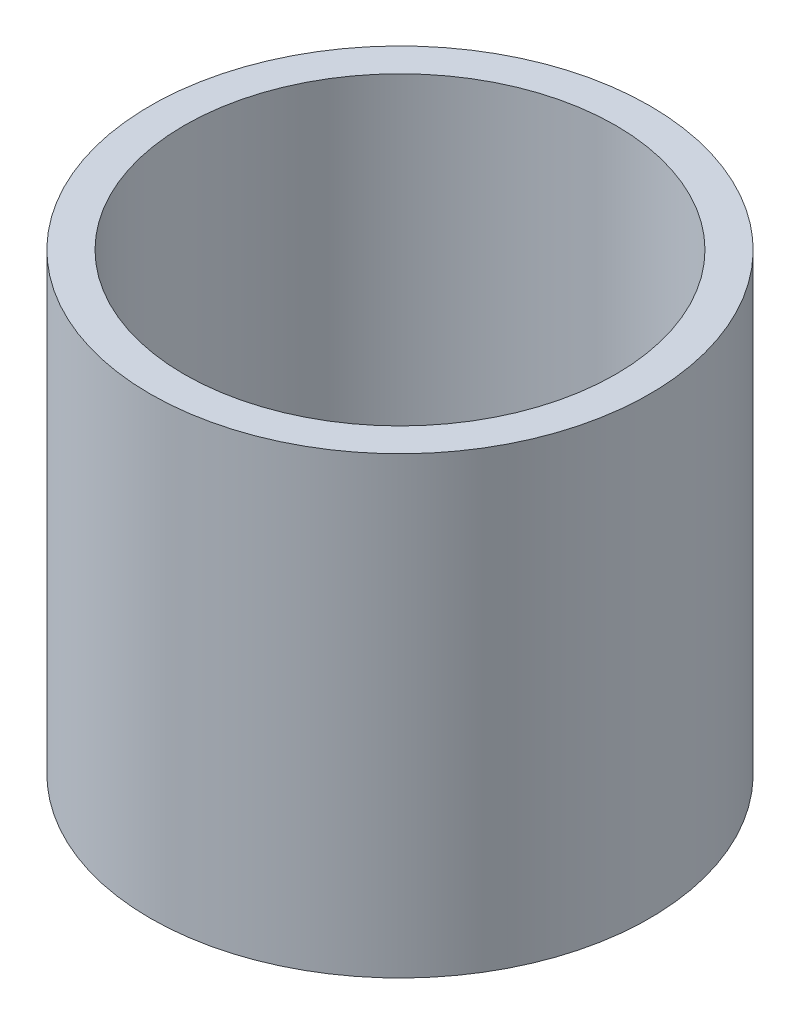
ISO-10303-21;
HEADER;
FILE_DESCRIPTION(('STEP AP214'),'2;1');
FILE_NAME('part.step','',(''),(''),'','','');
FILE_SCHEMA(('AUTOMOTIVE_DESIGN { 1 0 10303 214 1 1 1 1 }'));
ENDSEC;
DATA;
#1=APPLICATION_CONTEXT('core data for automotive mechanical design processes');
#2=APPLICATION_PROTOCOL_DEFINITION('international standard','automotive_design',2000,#1);
#3=PRODUCT_CONTEXT('',#1,'mechanical');
#4=PRODUCT('Part','Part','',(#3));
#5=PRODUCT_RELATED_PRODUCT_CATEGORY('part','',(#4));
#6=PRODUCT_DEFINITION_FORMATION('','',#4);
#7=PRODUCT_DEFINITION_CONTEXT('part definition',#1,'design');
#8=PRODUCT_DEFINITION('design','',#6,#7);
#9=PRODUCT_DEFINITION_SHAPE('','',#8);
#10=(LENGTH_UNIT() NAMED_UNIT(*) SI_UNIT(.MILLI.,.METRE.));
#11=(NAMED_UNIT(*) PLANE_ANGLE_UNIT() SI_UNIT($,.RADIAN.));
#12=(NAMED_UNIT(*) SI_UNIT($,.STERADIAN.) SOLID_ANGLE_UNIT());
#13=UNCERTAINTY_MEASURE_WITH_UNIT(LENGTH_MEASURE(1.E-05),#10,'distance_accuracy_value','');
#14=(GEOMETRIC_REPRESENTATION_CONTEXT(3) GLOBAL_UNCERTAINTY_ASSIGNED_CONTEXT((#13)) GLOBAL_UNIT_ASSIGNED_CONTEXT((#10,
#11,#12)) REPRESENTATION_CONTEXT('',''));
#15=CARTESIAN_POINT('',(0.,0.,0.));
#16=DIRECTION('',(0.,0.,1.));
#17=DIRECTION('',(1.,0.,0.));
#18=AXIS2_PLACEMENT_3D('',#15,#16,#17);
#19=CARTESIAN_POINT('',(0.,40.,0.));
#20=DIRECTION('',(0.,1.,0.));
#21=DIRECTION('',(0.,0.,1.));
#22=AXIS2_PLACEMENT_3D('',#19,#20,#21);
#23=PLANE('',#22);
#24=CARTESIAN_POINT('',(0.,40.,0.));
#25=DIRECTION('',(0.,1.,0.));
#26=DIRECTION('',(0.,0.,1.));
#27=AXIS2_PLACEMENT_3D('',#24,#25,#26);
#28=CIRCLE('',#27,22.);
#29=CARTESIAN_POINT('',(0.,40.,22.));
#30=VERTEX_POINT('',#29);
#31=EDGE_CURVE('E10',#30,#30,#28,.T.);
#32=ORIENTED_EDGE('',*,*,#31,.T.);
#33=EDGE_LOOP('',(#32));
#34=FACE_BOUND('',#33,.T.);
#35=CARTESIAN_POINT('',(0.,40.,0.));
#36=DIRECTION('',(0.,1.,0.));
#37=DIRECTION('',(0.,0.,1.));
#38=AXIS2_PLACEMENT_3D('',#35,#36,#37);
#39=CIRCLE('',#38,19.);
#40=CARTESIAN_POINT('',(0.,40.,19.));
#41=VERTEX_POINT('',#40);
#42=EDGE_CURVE('E57',#41,#41,#39,.T.);
#43=ORIENTED_EDGE('',*,*,#42,.F.);
#44=EDGE_LOOP('',(#43));
#45=FACE_BOUND('',#44,.T.);
#46=ADVANCED_FACE('F43',(#34,#45),#23,.T.);
#47=CARTESIAN_POINT('',(0.,0.,0.));
#48=DIRECTION('',(0.,1.,0.));
#49=DIRECTION('',(0.,0.,1.));
#50=AXIS2_PLACEMENT_3D('',#47,#48,#49);
#51=PLANE('',#50);
#52=CARTESIAN_POINT('',(0.,0.,0.));
#53=DIRECTION('',(0.,1.,0.));
#54=DIRECTION('',(0.,0.,1.));
#55=AXIS2_PLACEMENT_3D('',#52,#53,#54);
#56=CIRCLE('',#55,22.);
#57=CARTESIAN_POINT('',(0.,0.,22.));
#58=VERTEX_POINT('',#57);
#59=EDGE_CURVE('E50',#58,#58,#56,.T.);
#60=ORIENTED_EDGE('',*,*,#59,.F.);
#61=EDGE_LOOP('',(#60));
#62=FACE_BOUND('',#61,.T.);
#63=CARTESIAN_POINT('',(0.,0.,0.));
#64=DIRECTION('',(0.,1.,0.));
#65=DIRECTION('',(0.,0.,1.));
#66=AXIS2_PLACEMENT_3D('',#63,#64,#65);
#67=CIRCLE('',#66,19.);
#68=CARTESIAN_POINT('',(0.,0.,19.));
#69=VERTEX_POINT('',#68);
#70=EDGE_CURVE('E59',#69,#69,#67,.T.);
#71=ORIENTED_EDGE('',*,*,#70,.T.);
#72=EDGE_LOOP('',(#71));
#73=FACE_BOUND('',#72,.T.);
#74=ADVANCED_FACE('F68',(#62,#73),#51,.F.);
#75=CARTESIAN_POINT('',(0.,40.,0.));
#76=DIRECTION('',(0.,-1.,0.));
#77=DIRECTION('',(0.,0.,-1.));
#78=AXIS2_PLACEMENT_3D('',#75,#76,#77);
#79=CYLINDRICAL_SURFACE('',#78,22.);
#80=ORIENTED_EDGE('',*,*,#31,.F.);
#81=EDGE_LOOP('',(#80));
#82=FACE_BOUND('',#81,.T.);
#83=ORIENTED_EDGE('',*,*,#59,.T.);
#84=EDGE_LOOP('',(#83));
#85=FACE_BOUND('',#84,.T.);
#86=ADVANCED_FACE('F44',(#82,#85),#79,.T.);
#87=CARTESIAN_POINT('',(0.,40.,0.));
#88=DIRECTION('',(0.,-1.,0.));
#89=DIRECTION('',(0.,0.,-1.));
#90=AXIS2_PLACEMENT_3D('',#87,#88,#89);
#91=CYLINDRICAL_SURFACE('',#90,19.);
#92=ORIENTED_EDGE('',*,*,#42,.T.);
#93=EDGE_LOOP('',(#92));
#94=FACE_BOUND('',#93,.T.);
#95=ORIENTED_EDGE('',*,*,#70,.F.);
#96=EDGE_LOOP('',(#95));
#97=FACE_BOUND('',#96,.T.);
#98=ADVANCED_FACE('F67',(#94,#97),#91,.F.);
#99=CLOSED_SHELL('',(#46,#74,#86,#98));
#100=MANIFOLD_SOLID_BREP('B2',#99);
#101=ADVANCED_BREP_SHAPE_REPRESENTATION('',(#18,#100),#14);
#102=SHAPE_DEFINITION_REPRESENTATION(#9,#101);
ENDSEC;
END-ISO-10303-21;
